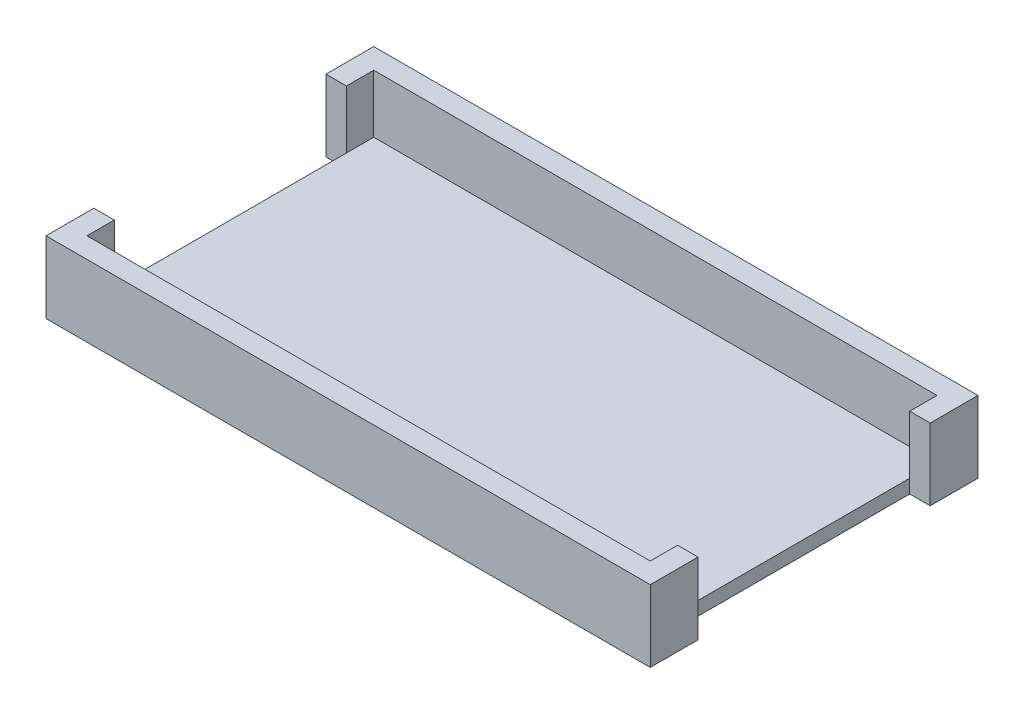
ISO-10303-21;
HEADER;
FILE_DESCRIPTION(('STEP AP214'),'2;1');
FILE_NAME('part.step','',(''),(''),'','','');
FILE_SCHEMA(('AUTOMOTIVE_DESIGN { 1 0 10303 214 1 1 1 1 }'));
ENDSEC;
DATA;
#1=APPLICATION_CONTEXT('core data for automotive mechanical design processes');
#2=APPLICATION_PROTOCOL_DEFINITION('international standard','automotive_design',2000,#1);
#3=PRODUCT_CONTEXT('',#1,'mechanical');
#4=PRODUCT('Part','Part','',(#3));
#5=PRODUCT_RELATED_PRODUCT_CATEGORY('part','',(#4));
#6=PRODUCT_DEFINITION_FORMATION('','',#4);
#7=PRODUCT_DEFINITION_CONTEXT('part definition',#1,'design');
#8=PRODUCT_DEFINITION('design','',#6,#7);
#9=PRODUCT_DEFINITION_SHAPE('','',#8);
#10=(LENGTH_UNIT() NAMED_UNIT(*) SI_UNIT(.MILLI.,.METRE.));
#11=(NAMED_UNIT(*) PLANE_ANGLE_UNIT() SI_UNIT($,.RADIAN.));
#12=(NAMED_UNIT(*) SI_UNIT($,.STERADIAN.) SOLID_ANGLE_UNIT());
#13=UNCERTAINTY_MEASURE_WITH_UNIT(LENGTH_MEASURE(1.E-05),#10,'distance_accuracy_value','');
#14=(GEOMETRIC_REPRESENTATION_CONTEXT(3) GLOBAL_UNCERTAINTY_ASSIGNED_CONTEXT((#13)) GLOBAL_UNIT_ASSIGNED_CONTEXT((#10,
#11,#12)) REPRESENTATION_CONTEXT('',''));
#15=CARTESIAN_POINT('',(0.,0.,0.));
#16=DIRECTION('',(0.,0.,1.));
#17=DIRECTION('',(1.,0.,0.));
#18=AXIS2_PLACEMENT_3D('',#15,#16,#17);
#19=CARTESIAN_POINT('',(-20.625,1.,0.));
#20=DIRECTION('',(1.,0.,0.));
#21=DIRECTION('',(0.,0.,-1.));
#22=AXIS2_PLACEMENT_3D('',#19,#20,#21);
#23=PLANE('',#22);
#24=DIRECTION('',(0.,-1.,0.));
#25=VECTOR('',#24,1.);
#26=CARTESIAN_POINT('',(-20.625,5.25,8.5));
#27=LINE('',#26,#25);
#28=CARTESIAN_POINT('',(-20.625,1.,8.5));
#29=VERTEX_POINT('',#28);
#30=CARTESIAN_POINT('',(-20.625,0.,8.5));
#31=VERTEX_POINT('',#30);
#32=EDGE_CURVE('E257',#29,#31,#27,.T.);
#33=ORIENTED_EDGE('',*,*,#32,.F.);
#34=DIRECTION('',(0.,0.,1.));
#35=VECTOR('',#34,1.);
#36=CARTESIAN_POINT('',(-20.625,1.,0.));
#37=LINE('',#36,#35);
#38=CARTESIAN_POINT('',(-20.625,1.,-8.5));
#39=VERTEX_POINT('',#38);
#40=EDGE_CURVE('E264',#39,#29,#37,.T.);
#41=ORIENTED_EDGE('',*,*,#40,.F.);
#42=DIRECTION('',(0.,1.,0.));
#43=VECTOR('',#42,1.);
#44=CARTESIAN_POINT('',(-20.625,5.25,-8.5));
#45=LINE('',#44,#43);
#46=CARTESIAN_POINT('',(-20.625,0.,-8.5));
#47=VERTEX_POINT('',#46);
#48=EDGE_CURVE('E284',#47,#39,#45,.T.);
#49=ORIENTED_EDGE('',*,*,#48,.F.);
#50=DIRECTION('',(0.,0.,1.));
#51=VECTOR('',#50,1.);
#52=CARTESIAN_POINT('',(-20.625,0.,0.));
#53=LINE('',#52,#51);
#54=EDGE_CURVE('E65',#47,#31,#53,.T.);
#55=ORIENTED_EDGE('',*,*,#54,.T.);
#56=EDGE_LOOP('',(#33,#41,#49,#55));
#57=FACE_BOUND('',#56,.T.);
#58=ADVANCED_FACE('F41',(#57),#23,.F.);
#59=CARTESIAN_POINT('',(0.,5.25,-8.5));
#60=DIRECTION('',(0.,0.,1.));
#61=DIRECTION('',(1.,0.,0.));
#62=AXIS2_PLACEMENT_3D('',#59,#60,#61);
#63=PLANE('',#62);
#64=DIRECTION('',(-1.,0.,0.));
#65=VECTOR('',#64,1.);
#66=CARTESIAN_POINT('',(0.,0.,-8.5));
#67=LINE('',#66,#65);
#68=CARTESIAN_POINT('',(-22.125,0.,-8.5));
#69=VERTEX_POINT('',#68);
#70=EDGE_CURVE('E287',#47,#69,#67,.T.);
#71=ORIENTED_EDGE('',*,*,#70,.F.);
#72=ORIENTED_EDGE('',*,*,#48,.T.);
#73=DIRECTION('',(0.,-1.,0.));
#74=VECTOR('',#73,1.);
#75=CARTESIAN_POINT('',(-20.625,5.25,-8.5));
#76=LINE('',#75,#74);
#77=CARTESIAN_POINT('',(-20.625,5.25,-8.5));
#78=VERTEX_POINT('',#77);
#79=EDGE_CURVE('E11',#78,#39,#76,.T.);
#80=ORIENTED_EDGE('',*,*,#79,.F.);
#81=DIRECTION('',(-1.,0.,0.));
#82=VECTOR('',#81,1.);
#83=CARTESIAN_POINT('',(0.,5.25,-8.5));
#84=LINE('',#83,#82);
#85=CARTESIAN_POINT('',(-22.125,5.25,-8.5));
#86=VERTEX_POINT('',#85);
#87=EDGE_CURVE('E288',#78,#86,#84,.T.);
#88=ORIENTED_EDGE('',*,*,#87,.T.);
#89=DIRECTION('',(0.,-1.,0.));
#90=VECTOR('',#89,1.);
#91=CARTESIAN_POINT('',(-22.125,5.25,-8.5));
#92=LINE('',#91,#90);
#93=EDGE_CURVE('E317',#86,#69,#92,.T.);
#94=ORIENTED_EDGE('',*,*,#93,.T.);
#95=EDGE_LOOP('',(#71,#72,#80,#88,#94));
#96=FACE_BOUND('',#95,.T.);
#97=ADVANCED_FACE('F43',(#96),#63,.T.);
#98=CARTESIAN_POINT('',(-20.625,5.25,0.));
#99=DIRECTION('',(1.,0.,0.));
#100=DIRECTION('',(0.,0.,-1.));
#101=AXIS2_PLACEMENT_3D('',#98,#99,#100);
#102=PLANE('',#101);
#103=CARTESIAN_POINT('',(-20.625,1.,-10.5));
#104=VERTEX_POINT('',#103);
#105=EDGE_CURVE('E260',#104,#39,#37,.T.);
#106=ORIENTED_EDGE('',*,*,#105,.F.);
#107=DIRECTION('',(0.,-1.,0.));
#108=VECTOR('',#107,1.);
#109=CARTESIAN_POINT('',(-20.625,5.25,-10.5));
#110=LINE('',#109,#108);
#111=CARTESIAN_POINT('',(-20.625,5.25,-10.5));
#112=VERTEX_POINT('',#111);
#113=EDGE_CURVE('E50',#112,#104,#110,.T.);
#114=ORIENTED_EDGE('',*,*,#113,.F.);
#115=DIRECTION('',(0.,0.,1.));
#116=VECTOR('',#115,1.);
#117=CARTESIAN_POINT('',(-20.625,5.25,0.));
#118=LINE('',#117,#116);
#119=EDGE_CURVE('E292',#112,#78,#118,.T.);
#120=ORIENTED_EDGE('',*,*,#119,.T.);
#121=ORIENTED_EDGE('',*,*,#79,.T.);
#122=EDGE_LOOP('',(#106,#114,#120,#121));
#123=FACE_BOUND('',#122,.T.);
#124=ADVANCED_FACE('F427',(#123),#102,.T.);
#125=CARTESIAN_POINT('',(0.,5.25,-10.5));
#126=DIRECTION('',(0.,0.,-1.));
#127=DIRECTION('',(-1.,0.,0.));
#128=AXIS2_PLACEMENT_3D('',#125,#126,#127);
#129=PLANE('',#128);
#130=ORIENTED_EDGE('',*,*,#113,.T.);
#131=DIRECTION('',(1.,0.,0.));
#132=VECTOR('',#131,1.);
#133=CARTESIAN_POINT('',(0.,1.,-10.5));
#134=LINE('',#133,#132);
#135=CARTESIAN_POINT('',(20.625,1.,-10.5));
#136=VERTEX_POINT('',#135);
#137=EDGE_CURVE('E272',#104,#136,#134,.T.);
#138=ORIENTED_EDGE('',*,*,#137,.T.);
#139=DIRECTION('',(0.,-1.,0.));
#140=VECTOR('',#139,1.);
#141=CARTESIAN_POINT('',(20.625,5.25,-10.5));
#142=LINE('',#141,#140);
#143=CARTESIAN_POINT('',(20.625,5.25,-10.5));
#144=VERTEX_POINT('',#143);
#145=EDGE_CURVE('E351',#144,#136,#142,.T.);
#146=ORIENTED_EDGE('',*,*,#145,.F.);
#147=DIRECTION('',(1.,0.,0.));
#148=VECTOR('',#147,1.);
#149=CARTESIAN_POINT('',(0.,5.25,-10.5));
#150=LINE('',#149,#148);
#151=EDGE_CURVE('E297',#112,#144,#150,.T.);
#152=ORIENTED_EDGE('',*,*,#151,.F.);
#153=EDGE_LOOP('',(#130,#138,#146,#152));
#154=FACE_BOUND('',#153,.T.);
#155=ADVANCED_FACE('F359',(#154),#129,.F.);
#156=CARTESIAN_POINT('',(20.625,5.25,0.));
#157=DIRECTION('',(1.,0.,0.));
#158=DIRECTION('',(0.,0.,-1.));
#159=AXIS2_PLACEMENT_3D('',#156,#157,#158);
#160=PLANE('',#159);
#161=ORIENTED_EDGE('',*,*,#145,.T.);
#162=DIRECTION('',(0.,0.,1.));
#163=VECTOR('',#162,1.);
#164=CARTESIAN_POINT('',(20.625,1.,0.));
#165=LINE('',#164,#163);
#166=CARTESIAN_POINT('',(20.625,1.,-8.5));
#167=VERTEX_POINT('',#166);
#168=EDGE_CURVE('E269',#136,#167,#165,.T.);
#169=ORIENTED_EDGE('',*,*,#168,.T.);
#170=DIRECTION('',(0.,-1.,0.));
#171=VECTOR('',#170,1.);
#172=CARTESIAN_POINT('',(20.625,5.25,-8.5));
#173=LINE('',#172,#171);
#174=CARTESIAN_POINT('',(20.625,5.25,-8.5));
#175=VERTEX_POINT('',#174);
#176=EDGE_CURVE('E347',#175,#167,#173,.T.);
#177=ORIENTED_EDGE('',*,*,#176,.F.);
#178=DIRECTION('',(0.,0.,1.));
#179=VECTOR('',#178,1.);
#180=CARTESIAN_POINT('',(20.625,5.25,0.));
#181=LINE('',#180,#179);
#182=EDGE_CURVE('E300',#144,#175,#181,.T.);
#183=ORIENTED_EDGE('',*,*,#182,.F.);
#184=EDGE_LOOP('',(#161,#169,#177,#183));
#185=FACE_BOUND('',#184,.T.);
#186=ADVANCED_FACE('F370',(#185),#160,.F.);
#187=CARTESIAN_POINT('',(0.,5.25,-8.5));
#188=DIRECTION('',(0.,0.,-1.));
#189=DIRECTION('',(-1.,0.,0.));
#190=AXIS2_PLACEMENT_3D('',#187,#188,#189);
#191=PLANE('',#190);
#192=DIRECTION('',(1.,0.,0.));
#193=VECTOR('',#192,1.);
#194=CARTESIAN_POINT('',(0.,0.,-8.5));
#195=LINE('',#194,#193);
#196=CARTESIAN_POINT('',(20.625,0.,-8.5));
#197=VERTEX_POINT('',#196);
#198=CARTESIAN_POINT('',(22.125,0.,-8.5));
#199=VERTEX_POINT('',#198);
#200=EDGE_CURVE('E321',#197,#199,#195,.T.);
#201=ORIENTED_EDGE('',*,*,#200,.T.);
#202=DIRECTION('',(0.,-1.,0.));
#203=VECTOR('',#202,1.);
#204=CARTESIAN_POINT('',(22.125,5.25,-8.5));
#205=LINE('',#204,#203);
#206=CARTESIAN_POINT('',(22.125,5.25,-8.5));
#207=VERTEX_POINT('',#206);
#208=EDGE_CURVE('E344',#207,#199,#205,.T.);
#209=ORIENTED_EDGE('',*,*,#208,.F.);
#210=DIRECTION('',(1.,0.,0.));
#211=VECTOR('',#210,1.);
#212=CARTESIAN_POINT('',(0.,5.25,-8.5));
#213=LINE('',#212,#211);
#214=EDGE_CURVE('E303',#175,#207,#213,.T.);
#215=ORIENTED_EDGE('',*,*,#214,.F.);
#216=ORIENTED_EDGE('',*,*,#176,.T.);
#217=DIRECTION('',(0.,-1.,0.));
#218=VECTOR('',#217,1.);
#219=CARTESIAN_POINT('',(20.625,5.25,-8.5));
#220=LINE('',#219,#218);
#221=EDGE_CURVE('E276',#167,#197,#220,.T.);
#222=ORIENTED_EDGE('',*,*,#221,.T.);
#223=EDGE_LOOP('',(#201,#209,#215,#216,#222));
#224=FACE_BOUND('',#223,.T.);
#225=ADVANCED_FACE('F375',(#224),#191,.F.);
#226=CARTESIAN_POINT('',(22.125,5.25,0.));
#227=DIRECTION('',(1.,0.,0.));
#228=DIRECTION('',(0.,0.,-1.));
#229=AXIS2_PLACEMENT_3D('',#226,#227,#228);
#230=PLANE('',#229);
#231=DIRECTION('',(0.,0.,1.));
#232=VECTOR('',#231,1.);
#233=CARTESIAN_POINT('',(22.125,0.,0.));
#234=LINE('',#233,#232);
#235=CARTESIAN_POINT('',(22.125,0.,-12.));
#236=VERTEX_POINT('',#235);
#237=EDGE_CURVE('E325',#236,#199,#234,.T.);
#238=ORIENTED_EDGE('',*,*,#237,.F.);
#239=DIRECTION('',(0.,-1.,0.));
#240=VECTOR('',#239,1.);
#241=CARTESIAN_POINT('',(22.125,5.25,-12.));
#242=LINE('',#241,#240);
#243=CARTESIAN_POINT('',(22.125,5.25,-12.));
#244=VERTEX_POINT('',#243);
#245=EDGE_CURVE('E341',#244,#236,#242,.T.);
#246=ORIENTED_EDGE('',*,*,#245,.F.);
#247=DIRECTION('',(0.,0.,1.));
#248=VECTOR('',#247,1.);
#249=CARTESIAN_POINT('',(22.125,5.25,0.));
#250=LINE('',#249,#248);
#251=EDGE_CURVE('E306',#244,#207,#250,.T.);
#252=ORIENTED_EDGE('',*,*,#251,.T.);
#253=ORIENTED_EDGE('',*,*,#208,.T.);
#254=EDGE_LOOP('',(#238,#246,#252,#253));
#255=FACE_BOUND('',#254,.T.);
#256=ADVANCED_FACE('F444',(#255),#230,.T.);
#257=CARTESIAN_POINT('',(0.,5.25,-12.));
#258=DIRECTION('',(0.,0.,-1.));
#259=DIRECTION('',(-1.,0.,0.));
#260=AXIS2_PLACEMENT_3D('',#257,#258,#259);
#261=PLANE('',#260);
#262=DIRECTION('',(1.,0.,0.));
#263=VECTOR('',#262,1.);
#264=CARTESIAN_POINT('',(0.,0.,-12.));
#265=LINE('',#264,#263);
#266=CARTESIAN_POINT('',(-22.125,0.,-12.));
#267=VERTEX_POINT('',#266);
#268=EDGE_CURVE('E329',#267,#236,#265,.T.);
#269=ORIENTED_EDGE('',*,*,#268,.F.);
#270=DIRECTION('',(0.,-1.,0.));
#271=VECTOR('',#270,1.);
#272=CARTESIAN_POINT('',(-22.125,5.25,-12.));
#273=LINE('',#272,#271);
#274=CARTESIAN_POINT('',(-22.125,5.25,-12.));
#275=VERTEX_POINT('',#274);
#276=EDGE_CURVE('E338',#275,#267,#273,.T.);
#277=ORIENTED_EDGE('',*,*,#276,.F.);
#278=DIRECTION('',(1.,0.,0.));
#279=VECTOR('',#278,1.);
#280=CARTESIAN_POINT('',(0.,5.25,-12.));
#281=LINE('',#280,#279);
#282=EDGE_CURVE('E310',#275,#244,#281,.T.);
#283=ORIENTED_EDGE('',*,*,#282,.T.);
#284=ORIENTED_EDGE('',*,*,#245,.T.);
#285=EDGE_LOOP('',(#269,#277,#283,#284));
#286=FACE_BOUND('',#285,.T.);
#287=ADVANCED_FACE('F440',(#286),#261,.T.);
#288=CARTESIAN_POINT('',(-22.125,5.25,0.));
#289=DIRECTION('',(1.,0.,0.));
#290=DIRECTION('',(0.,0.,-1.));
#291=AXIS2_PLACEMENT_3D('',#288,#289,#290);
#292=PLANE('',#291);
#293=DIRECTION('',(0.,0.,1.));
#294=VECTOR('',#293,1.);
#295=CARTESIAN_POINT('',(-22.125,0.,0.));
#296=LINE('',#295,#294);
#297=EDGE_CURVE('E293',#267,#69,#296,.T.);
#298=ORIENTED_EDGE('',*,*,#297,.T.);
#299=ORIENTED_EDGE('',*,*,#93,.F.);
#300=DIRECTION('',(0.,0.,1.));
#301=VECTOR('',#300,1.);
#302=CARTESIAN_POINT('',(-22.125,5.25,0.));
#303=LINE('',#302,#301);
#304=EDGE_CURVE('E314',#275,#86,#303,.T.);
#305=ORIENTED_EDGE('',*,*,#304,.F.);
#306=ORIENTED_EDGE('',*,*,#276,.T.);
#307=EDGE_LOOP('',(#298,#299,#305,#306));
#308=FACE_BOUND('',#307,.T.);
#309=ADVANCED_FACE('F434',(#308),#292,.F.);
#310=CARTESIAN_POINT('',(0.,5.25,0.));
#311=DIRECTION('',(0.,1.,0.));
#312=DIRECTION('',(0.,0.,1.));
#313=AXIS2_PLACEMENT_3D('',#310,#311,#312);
#314=PLANE('',#313);
#315=ORIENTED_EDGE('',*,*,#87,.F.);
#316=ORIENTED_EDGE('',*,*,#119,.F.);
#317=ORIENTED_EDGE('',*,*,#151,.T.);
#318=ORIENTED_EDGE('',*,*,#182,.T.);
#319=ORIENTED_EDGE('',*,*,#214,.T.);
#320=ORIENTED_EDGE('',*,*,#251,.F.);
#321=ORIENTED_EDGE('',*,*,#282,.F.);
#322=ORIENTED_EDGE('',*,*,#304,.T.);
#323=EDGE_LOOP('',(#315,#316,#317,#318,#319,#320,#321,#322));
#324=FACE_BOUND('',#323,.T.);
#325=ADVANCED_FACE('F431',(#324),#314,.T.);
#326=CARTESIAN_POINT('',(0.,0.,0.));
#327=DIRECTION('',(0.,1.,0.));
#328=DIRECTION('',(0.,0.,1.));
#329=AXIS2_PLACEMENT_3D('',#326,#327,#328);
#330=PLANE('',#329);
#331=ORIENTED_EDGE('',*,*,#54,.F.);
#332=ORIENTED_EDGE('',*,*,#70,.T.);
#333=ORIENTED_EDGE('',*,*,#297,.F.);
#334=ORIENTED_EDGE('',*,*,#268,.T.);
#335=ORIENTED_EDGE('',*,*,#237,.T.);
#336=ORIENTED_EDGE('',*,*,#200,.F.);
#337=DIRECTION('',(0.,0.,1.));
#338=VECTOR('',#337,1.);
#339=CARTESIAN_POINT('',(20.625,0.,0.));
#340=LINE('',#339,#338);
#341=CARTESIAN_POINT('',(20.625,0.,8.5));
#342=VERTEX_POINT('',#341);
#343=EDGE_CURVE('E279',#197,#342,#340,.T.);
#344=ORIENTED_EDGE('',*,*,#343,.T.);
#345=DIRECTION('',(1.,0.,0.));
#346=VECTOR('',#345,1.);
#347=CARTESIAN_POINT('',(0.,0.,8.5));
#348=LINE('',#347,#346);
#349=CARTESIAN_POINT('',(22.125,0.,8.5));
#350=VERTEX_POINT('',#349);
#351=EDGE_CURVE('E192',#342,#350,#348,.T.);
#352=ORIENTED_EDGE('',*,*,#351,.T.);
#353=DIRECTION('',(0.,0.,1.));
#354=VECTOR('',#353,1.);
#355=CARTESIAN_POINT('',(22.125,0.,0.));
#356=LINE('',#355,#354);
#357=CARTESIAN_POINT('',(22.125,0.,12.));
#358=VERTEX_POINT('',#357);
#359=EDGE_CURVE('E230',#350,#358,#356,.T.);
#360=ORIENTED_EDGE('',*,*,#359,.T.);
#361=DIRECTION('',(1.,0.,0.));
#362=VECTOR('',#361,1.);
#363=CARTESIAN_POINT('',(0.,0.,12.));
#364=LINE('',#363,#362);
#365=CARTESIAN_POINT('',(-22.125,0.,12.));
#366=VERTEX_POINT('',#365);
#367=EDGE_CURVE('E226',#366,#358,#364,.T.);
#368=ORIENTED_EDGE('',*,*,#367,.F.);
#369=DIRECTION('',(0.,0.,1.));
#370=VECTOR('',#369,1.);
#371=CARTESIAN_POINT('',(-22.125,0.,0.));
#372=LINE('',#371,#370);
#373=CARTESIAN_POINT('',(-22.125,0.,8.5));
#374=VERTEX_POINT('',#373);
#375=EDGE_CURVE('E223',#374,#366,#372,.T.);
#376=ORIENTED_EDGE('',*,*,#375,.F.);
#377=DIRECTION('',(-1.,0.,0.));
#378=VECTOR('',#377,1.);
#379=CARTESIAN_POINT('',(0.,0.,8.5));
#380=LINE('',#379,#378);
#381=EDGE_CURVE('E220',#31,#374,#380,.T.);
#382=ORIENTED_EDGE('',*,*,#381,.F.);
#383=EDGE_LOOP('',(#331,#332,#333,#334,#335,#336,#344,#352,#360,#368,#376,#382));
#384=FACE_BOUND('',#383,.T.);
#385=ADVANCED_FACE('F381',(#384),#330,.F.);
#386=CARTESIAN_POINT('',(20.625,1.,0.));
#387=DIRECTION('',(1.,0.,0.));
#388=DIRECTION('',(0.,0.,-1.));
#389=AXIS2_PLACEMENT_3D('',#386,#387,#388);
#390=PLANE('',#389);
#391=DIRECTION('',(0.,-1.,0.));
#392=VECTOR('',#391,1.);
#393=CARTESIAN_POINT('',(20.625,5.25,8.5));
#394=LINE('',#393,#392);
#395=CARTESIAN_POINT('',(20.625,1.,8.5));
#396=VERTEX_POINT('',#395);
#397=EDGE_CURVE('E57',#396,#342,#394,.T.);
#398=ORIENTED_EDGE('',*,*,#397,.T.);
#399=ORIENTED_EDGE('',*,*,#343,.F.);
#400=ORIENTED_EDGE('',*,*,#221,.F.);
#401=EDGE_CURVE('E273',#167,#396,#165,.T.);
#402=ORIENTED_EDGE('',*,*,#401,.T.);
#403=EDGE_LOOP('',(#398,#399,#400,#402));
#404=FACE_BOUND('',#403,.T.);
#405=ADVANCED_FACE('F378',(#404),#390,.T.);
#406=CARTESIAN_POINT('',(0.,1.,0.));
#407=DIRECTION('',(0.,1.,0.));
#408=DIRECTION('',(0.,0.,1.));
#409=AXIS2_PLACEMENT_3D('',#406,#407,#408);
#410=PLANE('',#409);
#411=ORIENTED_EDGE('',*,*,#105,.T.);
#412=ORIENTED_EDGE('',*,*,#40,.T.);
#413=CARTESIAN_POINT('',(-20.625,1.,10.5));
#414=VERTEX_POINT('',#413);
#415=EDGE_CURVE('E265',#29,#414,#37,.T.);
#416=ORIENTED_EDGE('',*,*,#415,.T.);
#417=DIRECTION('',(1.,0.,0.));
#418=VECTOR('',#417,1.);
#419=CARTESIAN_POINT('',(0.,1.,10.5));
#420=LINE('',#419,#418);
#421=CARTESIAN_POINT('',(20.625,1.,10.5));
#422=VERTEX_POINT('',#421);
#423=EDGE_CURVE('E176',#414,#422,#420,.T.);
#424=ORIENTED_EDGE('',*,*,#423,.T.);
#425=EDGE_CURVE('E268',#396,#422,#165,.T.);
#426=ORIENTED_EDGE('',*,*,#425,.F.);
#427=ORIENTED_EDGE('',*,*,#401,.F.);
#428=ORIENTED_EDGE('',*,*,#168,.F.);
#429=ORIENTED_EDGE('',*,*,#137,.F.);
#430=EDGE_LOOP('',(#411,#412,#416,#424,#426,#427,#428,#429));
#431=FACE_BOUND('',#430,.T.);
#432=ADVANCED_FACE('F365',(#431),#410,.T.);
#433=CARTESIAN_POINT('',(0.,5.25,10.5));
#434=DIRECTION('',(0.,0.,-1.));
#435=DIRECTION('',(-1.,0.,0.));
#436=AXIS2_PLACEMENT_3D('',#433,#434,#435);
#437=PLANE('',#436);
#438=DIRECTION('',(0.,-1.,0.));
#439=VECTOR('',#438,1.);
#440=CARTESIAN_POINT('',(20.625,5.25,10.5));
#441=LINE('',#440,#439);
#442=CARTESIAN_POINT('',(20.625,5.25,10.5));
#443=VERTEX_POINT('',#442);
#444=EDGE_CURVE('E219',#443,#422,#441,.T.);
#445=ORIENTED_EDGE('',*,*,#444,.T.);
#446=ORIENTED_EDGE('',*,*,#423,.F.);
#447=DIRECTION('',(0.,-1.,0.));
#448=VECTOR('',#447,1.);
#449=CARTESIAN_POINT('',(-20.625,5.25,10.5));
#450=LINE('',#449,#448);
#451=CARTESIAN_POINT('',(-20.625,5.25,10.5));
#452=VERTEX_POINT('',#451);
#453=EDGE_CURVE('E171',#452,#414,#450,.T.);
#454=ORIENTED_EDGE('',*,*,#453,.F.);
#455=DIRECTION('',(1.,0.,0.));
#456=VECTOR('',#455,1.);
#457=CARTESIAN_POINT('',(0.,5.25,10.5));
#458=LINE('',#457,#456);
#459=EDGE_CURVE('E175',#452,#443,#458,.T.);
#460=ORIENTED_EDGE('',*,*,#459,.T.);
#461=EDGE_LOOP('',(#445,#446,#454,#460));
#462=FACE_BOUND('',#461,.T.);
#463=ADVANCED_FACE('F174',(#462),#437,.T.);
#464=CARTESIAN_POINT('',(-20.625,5.25,0.));
#465=DIRECTION('',(1.,0.,0.));
#466=DIRECTION('',(0.,0.,-1.));
#467=AXIS2_PLACEMENT_3D('',#464,#465,#466);
#468=PLANE('',#467);
#469=ORIENTED_EDGE('',*,*,#453,.T.);
#470=ORIENTED_EDGE('',*,*,#415,.F.);
#471=CARTESIAN_POINT('',(-20.625,5.25,8.5));
#472=VERTEX_POINT('',#471);
#473=EDGE_CURVE('E181',#472,#29,#27,.T.);
#474=ORIENTED_EDGE('',*,*,#473,.F.);
#475=DIRECTION('',(0.,0.,1.));
#476=VECTOR('',#475,1.);
#477=CARTESIAN_POINT('',(-20.625,5.25,0.));
#478=LINE('',#477,#476);
#479=EDGE_CURVE('E186',#472,#452,#478,.T.);
#480=ORIENTED_EDGE('',*,*,#479,.T.);
#481=EDGE_LOOP('',(#469,#470,#474,#480));
#482=FACE_BOUND('',#481,.T.);
#483=ADVANCED_FACE('F194',(#482),#468,.T.);
#484=CARTESIAN_POINT('',(0.,5.25,8.5));
#485=DIRECTION('',(0.,0.,1.));
#486=DIRECTION('',(1.,0.,0.));
#487=AXIS2_PLACEMENT_3D('',#484,#485,#486);
#488=PLANE('',#487);
#489=ORIENTED_EDGE('',*,*,#381,.T.);
#490=DIRECTION('',(0.,-1.,0.));
#491=VECTOR('',#490,1.);
#492=CARTESIAN_POINT('',(-22.125,5.25,8.5));
#493=LINE('',#492,#491);
#494=CARTESIAN_POINT('',(-22.125,5.25,8.5));
#495=VERTEX_POINT('',#494);
#496=EDGE_CURVE('E253',#495,#374,#493,.T.);
#497=ORIENTED_EDGE('',*,*,#496,.F.);
#498=DIRECTION('',(-1.,0.,0.));
#499=VECTOR('',#498,1.);
#500=CARTESIAN_POINT('',(0.,5.25,8.5));
#501=LINE('',#500,#499);
#502=EDGE_CURVE('E198',#472,#495,#501,.T.);
#503=ORIENTED_EDGE('',*,*,#502,.F.);
#504=ORIENTED_EDGE('',*,*,#473,.T.);
#505=ORIENTED_EDGE('',*,*,#32,.T.);
#506=EDGE_LOOP('',(#489,#497,#503,#504,#505));
#507=FACE_BOUND('',#506,.T.);
#508=ADVANCED_FACE('F401',(#507),#488,.F.);
#509=CARTESIAN_POINT('',(-22.125,5.25,0.));
#510=DIRECTION('',(1.,0.,0.));
#511=DIRECTION('',(0.,0.,-1.));
#512=AXIS2_PLACEMENT_3D('',#509,#510,#511);
#513=PLANE('',#512);
#514=ORIENTED_EDGE('',*,*,#375,.T.);
#515=DIRECTION('',(0.,-1.,0.));
#516=VECTOR('',#515,1.);
#517=CARTESIAN_POINT('',(-22.125,5.25,12.));
#518=LINE('',#517,#516);
#519=CARTESIAN_POINT('',(-22.125,5.25,12.));
#520=VERTEX_POINT('',#519);
#521=EDGE_CURVE('E249',#520,#366,#518,.T.);
#522=ORIENTED_EDGE('',*,*,#521,.F.);
#523=DIRECTION('',(0.,0.,1.));
#524=VECTOR('',#523,1.);
#525=CARTESIAN_POINT('',(-22.125,5.25,0.));
#526=LINE('',#525,#524);
#527=EDGE_CURVE('E201',#495,#520,#526,.T.);
#528=ORIENTED_EDGE('',*,*,#527,.F.);
#529=ORIENTED_EDGE('',*,*,#496,.T.);
#530=EDGE_LOOP('',(#514,#522,#528,#529));
#531=FACE_BOUND('',#530,.T.);
#532=ADVANCED_FACE('F398',(#531),#513,.F.);
#533=CARTESIAN_POINT('',(0.,5.25,12.));
#534=DIRECTION('',(0.,0.,-1.));
#535=DIRECTION('',(-1.,0.,0.));
#536=AXIS2_PLACEMENT_3D('',#533,#534,#535);
#537=PLANE('',#536);
#538=ORIENTED_EDGE('',*,*,#367,.T.);
#539=DIRECTION('',(0.,-1.,0.));
#540=VECTOR('',#539,1.);
#541=CARTESIAN_POINT('',(22.125,5.25,12.));
#542=LINE('',#541,#540);
#543=CARTESIAN_POINT('',(22.125,5.25,12.));
#544=VERTEX_POINT('',#543);
#545=EDGE_CURVE('E246',#544,#358,#542,.T.);
#546=ORIENTED_EDGE('',*,*,#545,.F.);
#547=DIRECTION('',(1.,0.,0.));
#548=VECTOR('',#547,1.);
#549=CARTESIAN_POINT('',(0.,5.25,12.));
#550=LINE('',#549,#548);
#551=EDGE_CURVE('E206',#520,#544,#550,.T.);
#552=ORIENTED_EDGE('',*,*,#551,.F.);
#553=ORIENTED_EDGE('',*,*,#521,.T.);
#554=EDGE_LOOP('',(#538,#546,#552,#553));
#555=FACE_BOUND('',#554,.T.);
#556=ADVANCED_FACE('F393',(#555),#537,.F.);
#557=CARTESIAN_POINT('',(22.125,5.25,0.));
#558=DIRECTION('',(1.,0.,0.));
#559=DIRECTION('',(0.,0.,-1.));
#560=AXIS2_PLACEMENT_3D('',#557,#558,#559);
#561=PLANE('',#560);
#562=ORIENTED_EDGE('',*,*,#359,.F.);
#563=DIRECTION('',(0.,-1.,0.));
#564=VECTOR('',#563,1.);
#565=CARTESIAN_POINT('',(22.125,5.25,8.5));
#566=LINE('',#565,#564);
#567=CARTESIAN_POINT('',(22.125,5.25,8.5));
#568=VERTEX_POINT('',#567);
#569=EDGE_CURVE('E243',#568,#350,#566,.T.);
#570=ORIENTED_EDGE('',*,*,#569,.F.);
#571=DIRECTION('',(0.,0.,1.));
#572=VECTOR('',#571,1.);
#573=CARTESIAN_POINT('',(22.125,5.25,0.));
#574=LINE('',#573,#572);
#575=EDGE_CURVE('E209',#568,#544,#574,.T.);
#576=ORIENTED_EDGE('',*,*,#575,.T.);
#577=ORIENTED_EDGE('',*,*,#545,.T.);
#578=EDGE_LOOP('',(#562,#570,#576,#577));
#579=FACE_BOUND('',#578,.T.);
#580=ADVANCED_FACE('F387',(#579),#561,.T.);
#581=CARTESIAN_POINT('',(0.,5.25,8.5));
#582=DIRECTION('',(0.,0.,-1.));
#583=DIRECTION('',(-1.,0.,0.));
#584=AXIS2_PLACEMENT_3D('',#581,#582,#583);
#585=PLANE('',#584);
#586=ORIENTED_EDGE('',*,*,#351,.F.);
#587=ORIENTED_EDGE('',*,*,#397,.F.);
#588=CARTESIAN_POINT('',(20.625,5.25,8.5));
#589=VERTEX_POINT('',#588);
#590=EDGE_CURVE('E239',#589,#396,#394,.T.);
#591=ORIENTED_EDGE('',*,*,#590,.F.);
#592=DIRECTION('',(1.,0.,0.));
#593=VECTOR('',#592,1.);
#594=CARTESIAN_POINT('',(0.,5.25,8.5));
#595=LINE('',#594,#593);
#596=EDGE_CURVE('E213',#589,#568,#595,.T.);
#597=ORIENTED_EDGE('',*,*,#596,.T.);
#598=ORIENTED_EDGE('',*,*,#569,.T.);
#599=EDGE_LOOP('',(#586,#587,#591,#597,#598));
#600=FACE_BOUND('',#599,.T.);
#601=ADVANCED_FACE('F383',(#600),#585,.T.);
#602=CARTESIAN_POINT('',(20.625,5.25,0.));
#603=DIRECTION('',(1.,0.,0.));
#604=DIRECTION('',(0.,0.,-1.));
#605=AXIS2_PLACEMENT_3D('',#602,#603,#604);
#606=PLANE('',#605);
#607=ORIENTED_EDGE('',*,*,#425,.T.);
#608=ORIENTED_EDGE('',*,*,#444,.F.);
#609=DIRECTION('',(0.,0.,1.));
#610=VECTOR('',#609,1.);
#611=CARTESIAN_POINT('',(20.625,5.25,0.));
#612=LINE('',#611,#610);
#613=EDGE_CURVE('E189',#589,#443,#612,.T.);
#614=ORIENTED_EDGE('',*,*,#613,.F.);
#615=ORIENTED_EDGE('',*,*,#590,.T.);
#616=EDGE_LOOP('',(#607,#608,#614,#615));
#617=FACE_BOUND('',#616,.T.);
#618=ADVANCED_FACE('F411',(#617),#606,.F.);
#619=CARTESIAN_POINT('',(0.,5.25,0.));
#620=DIRECTION('',(0.,1.,0.));
#621=DIRECTION('',(0.,0.,1.));
#622=AXIS2_PLACEMENT_3D('',#619,#620,#621);
#623=PLANE('',#622);
#624=ORIENTED_EDGE('',*,*,#459,.F.);
#625=ORIENTED_EDGE('',*,*,#479,.F.);
#626=ORIENTED_EDGE('',*,*,#502,.T.);
#627=ORIENTED_EDGE('',*,*,#527,.T.);
#628=ORIENTED_EDGE('',*,*,#551,.T.);
#629=ORIENTED_EDGE('',*,*,#575,.F.);
#630=ORIENTED_EDGE('',*,*,#596,.F.);
#631=ORIENTED_EDGE('',*,*,#613,.T.);
#632=EDGE_LOOP('',(#624,#625,#626,#627,#628,#629,#630,#631));
#633=FACE_BOUND('',#632,.T.);
#634=ADVANCED_FACE('F185',(#633),#623,.T.);
#635=CLOSED_SHELL('',(#58,#97,#124,#155,#186,#225,#256,#287,#309,#325,#385,#405,#432,#463,#483,
#508,#532,#556,#580,#601,#618,#634));
#636=MANIFOLD_SOLID_BREP('B2',#635);
#637=ADVANCED_BREP_SHAPE_REPRESENTATION('',(#18,#636),#14);
#638=SHAPE_DEFINITION_REPRESENTATION(#9,#637);
ENDSEC;
END-ISO-10303-21;
